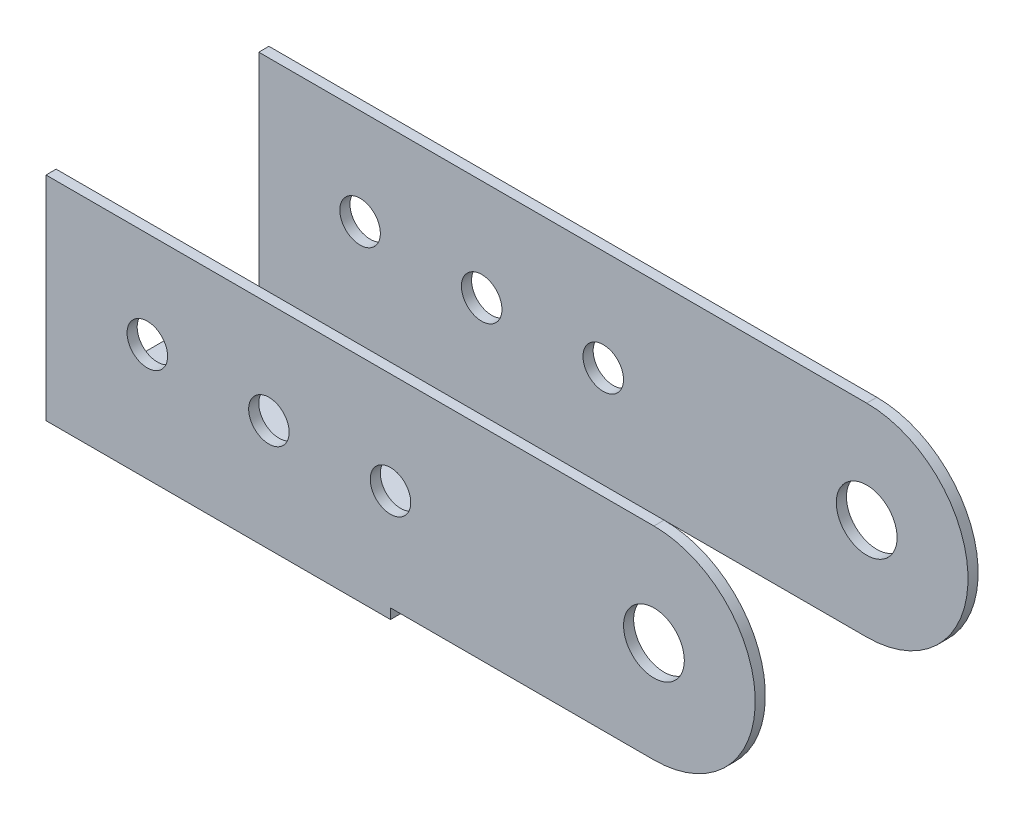
ISO-10303-21;
HEADER;
FILE_DESCRIPTION(('STEP AP214'),'2;1');
FILE_NAME('part.step','',(''),(''),'','','');
FILE_SCHEMA(('AUTOMOTIVE_DESIGN { 1 0 10303 214 1 1 1 1 }'));
ENDSEC;
DATA;
#1=APPLICATION_CONTEXT('core data for automotive mechanical design processes');
#2=APPLICATION_PROTOCOL_DEFINITION('international standard','automotive_design',2000,#1);
#3=PRODUCT_CONTEXT('',#1,'mechanical');
#4=PRODUCT('Part','Part','',(#3));
#5=PRODUCT_RELATED_PRODUCT_CATEGORY('part','',(#4));
#6=PRODUCT_DEFINITION_FORMATION('','',#4);
#7=PRODUCT_DEFINITION_CONTEXT('part definition',#1,'design');
#8=PRODUCT_DEFINITION('design','',#6,#7);
#9=PRODUCT_DEFINITION_SHAPE('','',#8);
#10=(LENGTH_UNIT() NAMED_UNIT(*) SI_UNIT(.MILLI.,.METRE.));
#11=(NAMED_UNIT(*) PLANE_ANGLE_UNIT() SI_UNIT($,.RADIAN.));
#12=(NAMED_UNIT(*) SI_UNIT($,.STERADIAN.) SOLID_ANGLE_UNIT());
#13=UNCERTAINTY_MEASURE_WITH_UNIT(LENGTH_MEASURE(1.E-05),#10,'distance_accuracy_value','');
#14=(GEOMETRIC_REPRESENTATION_CONTEXT(3) GLOBAL_UNCERTAINTY_ASSIGNED_CONTEXT((#13)) GLOBAL_UNIT_ASSIGNED_CONTEXT((#10,
#11,#12)) REPRESENTATION_CONTEXT('',''));
#15=CARTESIAN_POINT('',(0.,0.,0.));
#16=DIRECTION('',(0.,0.,1.));
#17=DIRECTION('',(1.,0.,0.));
#18=AXIS2_PLACEMENT_3D('',#15,#16,#17);
#19=CARTESIAN_POINT('',(-15.,-5.,10.5));
#20=DIRECTION('',(0.,1.,0.));
#21=DIRECTION('',(0.,0.,1.));
#22=AXIS2_PLACEMENT_3D('',#19,#20,#21);
#23=PLANE('',#22);
#24=DIRECTION('',(0.,0.,1.));
#25=VECTOR('',#24,1.);
#26=CARTESIAN_POINT('',(2.00000000000001,-5.,10.5));
#27=LINE('',#26,#25);
#28=CARTESIAN_POINT('',(2.00000000000001,-5.,10.));
#29=VERTEX_POINT('',#28);
#30=CARTESIAN_POINT('',(2.00000000000001,-5.,10.5));
#31=VERTEX_POINT('',#30);
#32=EDGE_CURVE('E11',#29,#31,#27,.T.);
#33=ORIENTED_EDGE('',*,*,#32,.F.);
#34=DIRECTION('',(1.,0.,0.));
#35=VECTOR('',#34,1.);
#36=CARTESIAN_POINT('',(-15.,-5.,10.));
#37=LINE('',#36,#35);
#38=CARTESIAN_POINT('',(15.,-5.,10.));
#39=VERTEX_POINT('',#38);
#40=EDGE_CURVE('E221',#29,#39,#37,.T.);
#41=ORIENTED_EDGE('',*,*,#40,.T.);
#42=DIRECTION('',(0.,0.,-1.));
#43=VECTOR('',#42,1.);
#44=CARTESIAN_POINT('',(15.,-5.,10.5));
#45=LINE('',#44,#43);
#46=CARTESIAN_POINT('',(15.,-5.,10.5));
#47=VERTEX_POINT('',#46);
#48=EDGE_CURVE('E44',#47,#39,#45,.T.);
#49=ORIENTED_EDGE('',*,*,#48,.F.);
#50=DIRECTION('',(1.,0.,0.));
#51=VECTOR('',#50,1.);
#52=CARTESIAN_POINT('',(-15.,-5.,10.5));
#53=LINE('',#52,#51);
#54=EDGE_CURVE('E51',#31,#47,#53,.T.);
#55=ORIENTED_EDGE('',*,*,#54,.F.);
#56=EDGE_LOOP('',(#33,#41,#49,#55));
#57=FACE_BOUND('',#56,.T.);
#58=ADVANCED_FACE('F36',(#57),#23,.F.);
#59=CARTESIAN_POINT('',(15.,0.,10.5));
#60=DIRECTION('',(0.,0.,1.));
#61=DIRECTION('',(1.,0.,0.));
#62=AXIS2_PLACEMENT_3D('',#59,#60,#61);
#63=PLANE('',#62);
#64=CARTESIAN_POINT('',(-3.99999999999999,0.,10.5));
#65=DIRECTION('',(0.,0.,1.));
#66=DIRECTION('',(1.,0.,0.));
#67=AXIS2_PLACEMENT_3D('',#64,#65,#66);
#68=CIRCLE('',#67,1.);
#69=CARTESIAN_POINT('',(-2.99999999999999,0.,10.5));
#70=VERTEX_POINT('',#69);
#71=EDGE_CURVE('E193',#70,#70,#68,.T.);
#72=ORIENTED_EDGE('',*,*,#71,.F.);
#73=EDGE_LOOP('',(#72));
#74=FACE_BOUND('',#73,.T.);
#75=CARTESIAN_POINT('',(15.,0.,10.5));
#76=DIRECTION('',(0.,0.,1.));
#77=DIRECTION('',(1.,0.,0.));
#78=AXIS2_PLACEMENT_3D('',#75,#76,#77);
#79=CIRCLE('',#78,1.5);
#80=CARTESIAN_POINT('',(16.5,0.,10.5));
#81=VERTEX_POINT('',#80);
#82=EDGE_CURVE('E205',#81,#81,#79,.T.);
#83=ORIENTED_EDGE('',*,*,#82,.F.);
#84=EDGE_LOOP('',(#83));
#85=FACE_BOUND('',#84,.T.);
#86=DIRECTION('',(0.,-1.,0.));
#87=VECTOR('',#86,1.);
#88=CARTESIAN_POINT('',(-15.,5.,10.5));
#89=LINE('',#88,#87);
#90=CARTESIAN_POINT('',(-15.,5.,10.5));
#91=VERTEX_POINT('',#90);
#92=CARTESIAN_POINT('',(-15.,-5.5,10.5));
#93=VERTEX_POINT('',#92);
#94=EDGE_CURVE('E211',#91,#93,#89,.T.);
#95=ORIENTED_EDGE('',*,*,#94,.T.);
#96=DIRECTION('',(-1.,0.,0.));
#97=VECTOR('',#96,1.);
#98=CARTESIAN_POINT('',(-15.,-5.5,10.5));
#99=LINE('',#98,#97);
#100=CARTESIAN_POINT('',(2.00000000000001,-5.5,10.5));
#101=VERTEX_POINT('',#100);
#102=EDGE_CURVE('E167',#101,#93,#99,.T.);
#103=ORIENTED_EDGE('',*,*,#102,.F.);
#104=DIRECTION('',(0.,1.,0.));
#105=VECTOR('',#104,1.);
#106=CARTESIAN_POINT('',(2.00000000000001,-5.5,10.5));
#107=LINE('',#106,#105);
#108=EDGE_CURVE('E183',#101,#31,#107,.T.);
#109=ORIENTED_EDGE('',*,*,#108,.T.);
#110=ORIENTED_EDGE('',*,*,#54,.T.);
#111=CARTESIAN_POINT('',(15.,0.,10.5));
#112=DIRECTION('',(0.,0.,1.));
#113=DIRECTION('',(1.,0.,0.));
#114=AXIS2_PLACEMENT_3D('',#111,#112,#113);
#115=CIRCLE('',#114,5.);
#116=CARTESIAN_POINT('',(15.,5.,10.5));
#117=VERTEX_POINT('',#116);
#118=EDGE_CURVE('E215',#47,#117,#115,.T.);
#119=ORIENTED_EDGE('',*,*,#118,.T.);
#120=DIRECTION('',(-1.,0.,0.));
#121=VECTOR('',#120,1.);
#122=CARTESIAN_POINT('',(15.,5.,10.5));
#123=LINE('',#122,#121);
#124=EDGE_CURVE('E217',#117,#91,#123,.T.);
#125=ORIENTED_EDGE('',*,*,#124,.T.);
#126=EDGE_LOOP('',(#95,#103,#109,#110,#119,#125));
#127=FACE_BOUND('',#126,.T.);
#128=CARTESIAN_POINT('',(2.00000000000001,0.,10.5));
#129=DIRECTION('',(0.,0.,1.));
#130=DIRECTION('',(1.,0.,0.));
#131=AXIS2_PLACEMENT_3D('',#128,#129,#130);
#132=CIRCLE('',#131,1.);
#133=CARTESIAN_POINT('',(3.00000000000001,0.,10.5));
#134=VERTEX_POINT('',#133);
#135=EDGE_CURVE('E199',#134,#134,#132,.T.);
#136=ORIENTED_EDGE('',*,*,#135,.F.);
#137=EDGE_LOOP('',(#136));
#138=FACE_BOUND('',#137,.T.);
#139=CARTESIAN_POINT('',(-10.,0.253438211378566,10.5));
#140=DIRECTION('',(0.,0.,1.));
#141=DIRECTION('',(1.,0.,0.));
#142=AXIS2_PLACEMENT_3D('',#139,#140,#141);
#143=CIRCLE('',#142,1.);
#144=CARTESIAN_POINT('',(-9.,0.253438211378566,10.5));
#145=VERTEX_POINT('',#144);
#146=EDGE_CURVE('E187',#145,#145,#143,.T.);
#147=ORIENTED_EDGE('',*,*,#146,.F.);
#148=EDGE_LOOP('',(#147));
#149=FACE_BOUND('',#148,.T.);
#150=ADVANCED_FACE('F253',(#74,#85,#127,#138,#149),#63,.T.);
#151=CARTESIAN_POINT('',(15.,0.,10.));
#152=DIRECTION('',(0.,0.,1.));
#153=DIRECTION('',(1.,0.,0.));
#154=AXIS2_PLACEMENT_3D('',#151,#152,#153);
#155=PLANE('',#154);
#156=DIRECTION('',(0.,-1.,0.));
#157=VECTOR('',#156,1.);
#158=CARTESIAN_POINT('',(-15.,5.,10.));
#159=LINE('',#158,#157);
#160=CARTESIAN_POINT('',(-15.,5.,10.));
#161=VERTEX_POINT('',#160);
#162=CARTESIAN_POINT('',(-15.,-5.,10.));
#163=VERTEX_POINT('',#162);
#164=EDGE_CURVE('E208',#161,#163,#159,.T.);
#165=ORIENTED_EDGE('',*,*,#164,.F.);
#166=DIRECTION('',(-1.,0.,0.));
#167=VECTOR('',#166,1.);
#168=CARTESIAN_POINT('',(15.,5.,10.));
#169=LINE('',#168,#167);
#170=CARTESIAN_POINT('',(15.,5.,10.));
#171=VERTEX_POINT('',#170);
#172=EDGE_CURVE('E213',#171,#161,#169,.T.);
#173=ORIENTED_EDGE('',*,*,#172,.F.);
#174=CARTESIAN_POINT('',(15.,0.,10.));
#175=DIRECTION('',(0.,0.,1.));
#176=DIRECTION('',(1.,0.,0.));
#177=AXIS2_PLACEMENT_3D('',#174,#175,#176);
#178=CIRCLE('',#177,5.);
#179=EDGE_CURVE('E225',#39,#171,#178,.T.);
#180=ORIENTED_EDGE('',*,*,#179,.F.);
#181=ORIENTED_EDGE('',*,*,#40,.F.);
#182=EDGE_CURVE('E222',#163,#29,#37,.T.);
#183=ORIENTED_EDGE('',*,*,#182,.F.);
#184=EDGE_LOOP('',(#165,#173,#180,#181,#183));
#185=FACE_BOUND('',#184,.T.);
#186=CARTESIAN_POINT('',(15.,0.,10.));
#187=DIRECTION('',(0.,0.,1.));
#188=DIRECTION('',(1.,0.,0.));
#189=AXIS2_PLACEMENT_3D('',#186,#187,#188);
#190=CIRCLE('',#189,1.5);
#191=CARTESIAN_POINT('',(16.5,0.,10.));
#192=VERTEX_POINT('',#191);
#193=EDGE_CURVE('E202',#192,#192,#190,.T.);
#194=ORIENTED_EDGE('',*,*,#193,.T.);
#195=EDGE_LOOP('',(#194));
#196=FACE_BOUND('',#195,.T.);
#197=CARTESIAN_POINT('',(2.00000000000001,0.,10.));
#198=DIRECTION('',(0.,0.,1.));
#199=DIRECTION('',(1.,0.,0.));
#200=AXIS2_PLACEMENT_3D('',#197,#198,#199);
#201=CIRCLE('',#200,1.);
#202=CARTESIAN_POINT('',(3.00000000000001,0.,10.));
#203=VERTEX_POINT('',#202);
#204=EDGE_CURVE('E196',#203,#203,#201,.T.);
#205=ORIENTED_EDGE('',*,*,#204,.T.);
#206=EDGE_LOOP('',(#205));
#207=FACE_BOUND('',#206,.T.);
#208=CARTESIAN_POINT('',(-3.99999999999999,0.,10.));
#209=DIRECTION('',(0.,0.,1.));
#210=DIRECTION('',(1.,0.,0.));
#211=AXIS2_PLACEMENT_3D('',#208,#209,#210);
#212=CIRCLE('',#211,1.);
#213=CARTESIAN_POINT('',(-2.99999999999999,0.,10.));
#214=VERTEX_POINT('',#213);
#215=EDGE_CURVE('E190',#214,#214,#212,.T.);
#216=ORIENTED_EDGE('',*,*,#215,.T.);
#217=EDGE_LOOP('',(#216));
#218=FACE_BOUND('',#217,.T.);
#219=CARTESIAN_POINT('',(-10.,0.253438211378566,10.));
#220=DIRECTION('',(0.,0.,1.));
#221=DIRECTION('',(1.,0.,0.));
#222=AXIS2_PLACEMENT_3D('',#219,#220,#221);
#223=CIRCLE('',#222,1.);
#224=CARTESIAN_POINT('',(-9.,0.253438211378566,10.));
#225=VERTEX_POINT('',#224);
#226=EDGE_CURVE('E186',#225,#225,#223,.T.);
#227=ORIENTED_EDGE('',*,*,#226,.T.);
#228=EDGE_LOOP('',(#227));
#229=FACE_BOUND('',#228,.T.);
#230=ADVANCED_FACE('F242',(#185,#196,#207,#218,#229),#155,.F.);
#231=CARTESIAN_POINT('',(-15.,5.,10.5));
#232=DIRECTION('',(1.,0.,0.));
#233=DIRECTION('',(0.,0.,-1.));
#234=AXIS2_PLACEMENT_3D('',#231,#232,#233);
#235=PLANE('',#234);
#236=ORIENTED_EDGE('',*,*,#164,.T.);
#237=DIRECTION('',(0.,0.,-1.));
#238=VECTOR('',#237,1.);
#239=CARTESIAN_POINT('',(-15.,-5.,-0.5));
#240=LINE('',#239,#238);
#241=CARTESIAN_POINT('',(-15.,-5.,0.));
#242=VERTEX_POINT('',#241);
#243=EDGE_CURVE('E168',#163,#242,#240,.T.);
#244=ORIENTED_EDGE('',*,*,#243,.T.);
#245=DIRECTION('',(0.,-1.,0.));
#246=VECTOR('',#245,1.);
#247=CARTESIAN_POINT('',(-15.,5.,0.));
#248=LINE('',#247,#246);
#249=CARTESIAN_POINT('',(-15.,5.,0.));
#250=VERTEX_POINT('',#249);
#251=EDGE_CURVE('E160',#250,#242,#248,.T.);
#252=ORIENTED_EDGE('',*,*,#251,.F.);
#253=DIRECTION('',(0.,0.,1.));
#254=VECTOR('',#253,1.);
#255=CARTESIAN_POINT('',(-15.,5.,-0.5));
#256=LINE('',#255,#254);
#257=CARTESIAN_POINT('',(-15.,5.,-0.5));
#258=VERTEX_POINT('',#257);
#259=EDGE_CURVE('E129',#258,#250,#256,.T.);
#260=ORIENTED_EDGE('',*,*,#259,.F.);
#261=DIRECTION('',(0.,1.,0.));
#262=VECTOR('',#261,1.);
#263=CARTESIAN_POINT('',(-15.,-5.5,-0.5));
#264=LINE('',#263,#262);
#265=CARTESIAN_POINT('',(-15.,-5.5,-0.5));
#266=VERTEX_POINT('',#265);
#267=EDGE_CURVE('E139',#266,#258,#264,.T.);
#268=ORIENTED_EDGE('',*,*,#267,.F.);
#269=DIRECTION('',(0.,0.,-1.));
#270=VECTOR('',#269,1.);
#271=CARTESIAN_POINT('',(-15.,-5.5,-0.5));
#272=LINE('',#271,#270);
#273=EDGE_CURVE('E171',#93,#266,#272,.T.);
#274=ORIENTED_EDGE('',*,*,#273,.F.);
#275=ORIENTED_EDGE('',*,*,#94,.F.);
#276=DIRECTION('',(0.,0.,-1.));
#277=VECTOR('',#276,1.);
#278=CARTESIAN_POINT('',(-15.,5.,10.5));
#279=LINE('',#278,#277);
#280=EDGE_CURVE('E219',#91,#161,#279,.T.);
#281=ORIENTED_EDGE('',*,*,#280,.T.);
#282=EDGE_LOOP('',(#236,#244,#252,#260,#268,#274,#275,#281));
#283=FACE_BOUND('',#282,.T.);
#284=ADVANCED_FACE('F38',(#283),#235,.F.);
#285=CARTESIAN_POINT('',(15.,0.,10.5));
#286=DIRECTION('',(0.,0.,-1.));
#287=DIRECTION('',(-1.,0.,0.));
#288=AXIS2_PLACEMENT_3D('',#285,#286,#287);
#289=CYLINDRICAL_SURFACE('',#288,5.);
#290=ORIENTED_EDGE('',*,*,#179,.T.);
#291=DIRECTION('',(0.,0.,-1.));
#292=VECTOR('',#291,1.);
#293=CARTESIAN_POINT('',(15.,5.,10.5));
#294=LINE('',#293,#292);
#295=EDGE_CURVE('E230',#117,#171,#294,.T.);
#296=ORIENTED_EDGE('',*,*,#295,.F.);
#297=ORIENTED_EDGE('',*,*,#118,.F.);
#298=ORIENTED_EDGE('',*,*,#48,.T.);
#299=EDGE_LOOP('',(#290,#296,#297,#298));
#300=FACE_BOUND('',#299,.T.);
#301=ADVANCED_FACE('F236',(#300),#289,.T.);
#302=CARTESIAN_POINT('',(15.,5.,10.5));
#303=DIRECTION('',(0.,-1.,0.));
#304=DIRECTION('',(0.,0.,-1.));
#305=AXIS2_PLACEMENT_3D('',#302,#303,#304);
#306=PLANE('',#305);
#307=ORIENTED_EDGE('',*,*,#172,.T.);
#308=ORIENTED_EDGE('',*,*,#280,.F.);
#309=ORIENTED_EDGE('',*,*,#124,.F.);
#310=ORIENTED_EDGE('',*,*,#295,.T.);
#311=EDGE_LOOP('',(#307,#308,#309,#310));
#312=FACE_BOUND('',#311,.T.);
#313=ADVANCED_FACE('F247',(#312),#306,.F.);
#314=CARTESIAN_POINT('',(15.,0.,10.5));
#315=DIRECTION('',(0.,0.,-1.));
#316=DIRECTION('',(-1.,0.,0.));
#317=AXIS2_PLACEMENT_3D('',#314,#315,#316);
#318=CYLINDRICAL_SURFACE('',#317,1.5);
#319=ORIENTED_EDGE('',*,*,#82,.T.);
#320=EDGE_LOOP('',(#319));
#321=FACE_BOUND('',#320,.T.);
#322=ORIENTED_EDGE('',*,*,#193,.F.);
#323=EDGE_LOOP('',(#322));
#324=FACE_BOUND('',#323,.T.);
#325=ADVANCED_FACE('F272',(#321,#324),#318,.F.);
#326=CARTESIAN_POINT('',(2.00000000000001,0.,10.5));
#327=DIRECTION('',(0.,0.,-1.));
#328=DIRECTION('',(-1.,0.,0.));
#329=AXIS2_PLACEMENT_3D('',#326,#327,#328);
#330=CYLINDRICAL_SURFACE('',#329,1.);
#331=ORIENTED_EDGE('',*,*,#135,.T.);
#332=EDGE_LOOP('',(#331));
#333=FACE_BOUND('',#332,.T.);
#334=ORIENTED_EDGE('',*,*,#204,.F.);
#335=EDGE_LOOP('',(#334));
#336=FACE_BOUND('',#335,.T.);
#337=ADVANCED_FACE('F277',(#333,#336),#330,.F.);
#338=CARTESIAN_POINT('',(-3.99999999999999,0.,10.5));
#339=DIRECTION('',(0.,0.,-1.));
#340=DIRECTION('',(-1.,0.,0.));
#341=AXIS2_PLACEMENT_3D('',#338,#339,#340);
#342=CYLINDRICAL_SURFACE('',#341,1.);
#343=ORIENTED_EDGE('',*,*,#71,.T.);
#344=EDGE_LOOP('',(#343));
#345=FACE_BOUND('',#344,.T.);
#346=ORIENTED_EDGE('',*,*,#215,.F.);
#347=EDGE_LOOP('',(#346));
#348=FACE_BOUND('',#347,.T.);
#349=ADVANCED_FACE('F281',(#345,#348),#342,.F.);
#350=CARTESIAN_POINT('',(-10.,0.253438211378566,10.5));
#351=DIRECTION('',(0.,0.,-1.));
#352=DIRECTION('',(-1.,0.,0.));
#353=AXIS2_PLACEMENT_3D('',#350,#351,#352);
#354=CYLINDRICAL_SURFACE('',#353,1.);
#355=ORIENTED_EDGE('',*,*,#146,.T.);
#356=EDGE_LOOP('',(#355));
#357=FACE_BOUND('',#356,.T.);
#358=ORIENTED_EDGE('',*,*,#226,.F.);
#359=EDGE_LOOP('',(#358));
#360=FACE_BOUND('',#359,.T.);
#361=ADVANCED_FACE('F285',(#357,#360),#354,.F.);
#362=CARTESIAN_POINT('',(0.,-5.,0.));
#363=DIRECTION('',(0.,1.,0.));
#364=DIRECTION('',(0.,0.,1.));
#365=AXIS2_PLACEMENT_3D('',#362,#363,#364);
#366=PLANE('',#365);
#367=DIRECTION('',(1.,0.,0.));
#368=VECTOR('',#367,1.);
#369=CARTESIAN_POINT('',(-15.,-5.,0.));
#370=LINE('',#369,#368);
#371=CARTESIAN_POINT('',(2.00000000000001,-5.,0.));
#372=VERTEX_POINT('',#371);
#373=EDGE_CURVE('E146',#242,#372,#370,.T.);
#374=ORIENTED_EDGE('',*,*,#373,.F.);
#375=ORIENTED_EDGE('',*,*,#243,.F.);
#376=ORIENTED_EDGE('',*,*,#182,.T.);
#377=DIRECTION('',(0.,0.,1.));
#378=VECTOR('',#377,1.);
#379=CARTESIAN_POINT('',(2.00000000000001,-5.,10.5));
#380=LINE('',#379,#378);
#381=EDGE_CURVE('E57',#372,#29,#380,.T.);
#382=ORIENTED_EDGE('',*,*,#381,.F.);
#383=EDGE_LOOP('',(#374,#375,#376,#382));
#384=FACE_BOUND('',#383,.T.);
#385=ADVANCED_FACE('F289',(#384),#366,.T.);
#386=CARTESIAN_POINT('',(2.00000000000001,-5.5,10.5));
#387=DIRECTION('',(-1.,0.,0.));
#388=DIRECTION('',(0.,0.,1.));
#389=AXIS2_PLACEMENT_3D('',#386,#387,#388);
#390=PLANE('',#389);
#391=CARTESIAN_POINT('',(2.00000000000001,-5.,-0.5));
#392=VERTEX_POINT('',#391);
#393=EDGE_CURVE('E176',#392,#372,#380,.T.);
#394=ORIENTED_EDGE('',*,*,#393,.T.);
#395=ORIENTED_EDGE('',*,*,#381,.T.);
#396=ORIENTED_EDGE('',*,*,#32,.T.);
#397=ORIENTED_EDGE('',*,*,#108,.F.);
#398=DIRECTION('',(0.,0.,1.));
#399=VECTOR('',#398,1.);
#400=CARTESIAN_POINT('',(2.00000000000001,-5.5,10.5));
#401=LINE('',#400,#399);
#402=CARTESIAN_POINT('',(2.00000000000001,-5.5,-0.5));
#403=VERTEX_POINT('',#402);
#404=EDGE_CURVE('E164',#403,#101,#401,.T.);
#405=ORIENTED_EDGE('',*,*,#404,.F.);
#406=DIRECTION('',(0.,1.,0.));
#407=VECTOR('',#406,1.);
#408=CARTESIAN_POINT('',(2.00000000000001,-5.5,-0.5));
#409=LINE('',#408,#407);
#410=EDGE_CURVE('E175',#403,#392,#409,.T.);
#411=ORIENTED_EDGE('',*,*,#410,.T.);
#412=EDGE_LOOP('',(#394,#395,#396,#397,#405,#411));
#413=FACE_BOUND('',#412,.T.);
#414=ADVANCED_FACE('F260',(#413),#390,.F.);
#415=CARTESIAN_POINT('',(2.00000000000001,-5.5,-0.5));
#416=DIRECTION('',(0.,0.,1.));
#417=DIRECTION('',(1.,0.,0.));
#418=AXIS2_PLACEMENT_3D('',#415,#416,#417);
#419=PLANE('',#418);
#420=ORIENTED_EDGE('',*,*,#267,.T.);
#421=DIRECTION('',(-1.,0.,0.));
#422=VECTOR('',#421,1.);
#423=CARTESIAN_POINT('',(-15.,5.,-0.5));
#424=LINE('',#423,#422);
#425=CARTESIAN_POINT('',(15.,5.,-0.5));
#426=VERTEX_POINT('',#425);
#427=EDGE_CURVE('E122',#426,#258,#424,.T.);
#428=ORIENTED_EDGE('',*,*,#427,.F.);
#429=CARTESIAN_POINT('',(15.,0.,-0.5));
#430=DIRECTION('',(0.,0.,1.));
#431=DIRECTION('',(1.,0.,0.));
#432=AXIS2_PLACEMENT_3D('',#429,#430,#431);
#433=CIRCLE('',#432,5.);
#434=CARTESIAN_POINT('',(15.,-5.,-0.5));
#435=VERTEX_POINT('',#434);
#436=EDGE_CURVE('E136',#435,#426,#433,.T.);
#437=ORIENTED_EDGE('',*,*,#436,.F.);
#438=DIRECTION('',(1.,0.,0.));
#439=VECTOR('',#438,1.);
#440=CARTESIAN_POINT('',(-15.,-5.,-0.5));
#441=LINE('',#440,#439);
#442=EDGE_CURVE('E130',#392,#435,#441,.T.);
#443=ORIENTED_EDGE('',*,*,#442,.F.);
#444=ORIENTED_EDGE('',*,*,#410,.F.);
#445=DIRECTION('',(1.,0.,0.));
#446=VECTOR('',#445,1.);
#447=CARTESIAN_POINT('',(2.00000000000001,-5.5,-0.5));
#448=LINE('',#447,#446);
#449=EDGE_CURVE('E173',#266,#403,#448,.T.);
#450=ORIENTED_EDGE('',*,*,#449,.F.);
#451=EDGE_LOOP('',(#420,#428,#437,#443,#444,#450));
#452=FACE_BOUND('',#451,.T.);
#453=CARTESIAN_POINT('',(2.00000000000001,0.,-0.5));
#454=DIRECTION('',(0.,0.,1.));
#455=DIRECTION('',(1.,0.,0.));
#456=AXIS2_PLACEMENT_3D('',#453,#454,#455);
#457=CIRCLE('',#456,1.);
#458=CARTESIAN_POINT('',(3.00000000000001,0.,-0.5));
#459=VERTEX_POINT('',#458);
#460=EDGE_CURVE('E332',#459,#459,#457,.T.);
#461=ORIENTED_EDGE('',*,*,#460,.T.);
#462=EDGE_LOOP('',(#461));
#463=FACE_BOUND('',#462,.T.);
#464=CARTESIAN_POINT('',(-3.99999999999999,0.,-0.5));
#465=DIRECTION('',(0.,0.,1.));
#466=DIRECTION('',(1.,0.,0.));
#467=AXIS2_PLACEMENT_3D('',#464,#465,#466);
#468=CIRCLE('',#467,1.);
#469=CARTESIAN_POINT('',(-2.99999999999999,0.,-0.5));
#470=VERTEX_POINT('',#469);
#471=EDGE_CURVE('E340',#470,#470,#468,.T.);
#472=ORIENTED_EDGE('',*,*,#471,.T.);
#473=EDGE_LOOP('',(#472));
#474=FACE_BOUND('',#473,.T.);
#475=CARTESIAN_POINT('',(-10.,0.253438211378566,-0.5));
#476=DIRECTION('',(0.,0.,1.));
#477=DIRECTION('',(1.,0.,0.));
#478=AXIS2_PLACEMENT_3D('',#475,#476,#477);
#479=CIRCLE('',#478,1.);
#480=CARTESIAN_POINT('',(-9.,0.253438211378566,-0.5));
#481=VERTEX_POINT('',#480);
#482=EDGE_CURVE('E346',#481,#481,#479,.T.);
#483=ORIENTED_EDGE('',*,*,#482,.T.);
#484=EDGE_LOOP('',(#483));
#485=FACE_BOUND('',#484,.T.);
#486=CARTESIAN_POINT('',(15.,0.,-0.5));
#487=DIRECTION('',(0.,0.,1.));
#488=DIRECTION('',(1.,0.,0.));
#489=AXIS2_PLACEMENT_3D('',#486,#487,#488);
#490=CIRCLE('',#489,1.5);
#491=CARTESIAN_POINT('',(16.5,0.,-0.5));
#492=VERTEX_POINT('',#491);
#493=EDGE_CURVE('E158',#492,#492,#490,.T.);
#494=ORIENTED_EDGE('',*,*,#493,.T.);
#495=EDGE_LOOP('',(#494));
#496=FACE_BOUND('',#495,.T.);
#497=ADVANCED_FACE('F134',(#452,#463,#474,#485,#496),#419,.F.);
#498=CARTESIAN_POINT('',(0.,-5.5,0.));
#499=DIRECTION('',(0.,1.,0.));
#500=DIRECTION('',(0.,0.,1.));
#501=AXIS2_PLACEMENT_3D('',#498,#499,#500);
#502=PLANE('',#501);
#503=ORIENTED_EDGE('',*,*,#404,.T.);
#504=ORIENTED_EDGE('',*,*,#102,.T.);
#505=ORIENTED_EDGE('',*,*,#273,.T.);
#506=ORIENTED_EDGE('',*,*,#449,.T.);
#507=EDGE_LOOP('',(#503,#504,#505,#506));
#508=FACE_BOUND('',#507,.T.);
#509=ADVANCED_FACE('F256',(#508),#502,.F.);
#510=CARTESIAN_POINT('',(-15.,-5.,-0.5));
#511=DIRECTION('',(0.,-1.,0.));
#512=DIRECTION('',(0.,0.,-1.));
#513=AXIS2_PLACEMENT_3D('',#510,#511,#512);
#514=PLANE('',#513);
#515=ORIENTED_EDGE('',*,*,#393,.F.);
#516=ORIENTED_EDGE('',*,*,#442,.T.);
#517=DIRECTION('',(0.,0.,1.));
#518=VECTOR('',#517,1.);
#519=CARTESIAN_POINT('',(15.,-5.,-0.5));
#520=LINE('',#519,#518);
#521=CARTESIAN_POINT('',(15.,-5.,0.));
#522=VERTEX_POINT('',#521);
#523=EDGE_CURVE('E145',#435,#522,#520,.T.);
#524=ORIENTED_EDGE('',*,*,#523,.T.);
#525=EDGE_CURVE('E149',#372,#522,#370,.T.);
#526=ORIENTED_EDGE('',*,*,#525,.F.);
#527=EDGE_LOOP('',(#515,#516,#524,#526));
#528=FACE_BOUND('',#527,.T.);
#529=ADVANCED_FACE('F300',(#528),#514,.T.);
#530=CARTESIAN_POINT('',(15.,0.,-0.5));
#531=DIRECTION('',(0.,0.,1.));
#532=DIRECTION('',(1.,0.,0.));
#533=AXIS2_PLACEMENT_3D('',#530,#531,#532);
#534=CYLINDRICAL_SURFACE('',#533,5.);
#535=CARTESIAN_POINT('',(15.,0.,0.));
#536=DIRECTION('',(0.,0.,1.));
#537=DIRECTION('',(1.,0.,0.));
#538=AXIS2_PLACEMENT_3D('',#535,#536,#537);
#539=CIRCLE('',#538,5.);
#540=CARTESIAN_POINT('',(15.,5.,0.));
#541=VERTEX_POINT('',#540);
#542=EDGE_CURVE('E156',#522,#541,#539,.T.);
#543=ORIENTED_EDGE('',*,*,#542,.F.);
#544=ORIENTED_EDGE('',*,*,#523,.F.);
#545=ORIENTED_EDGE('',*,*,#436,.T.);
#546=DIRECTION('',(0.,0.,1.));
#547=VECTOR('',#546,1.);
#548=CARTESIAN_POINT('',(15.,5.,-0.5));
#549=LINE('',#548,#547);
#550=EDGE_CURVE('E119',#426,#541,#549,.T.);
#551=ORIENTED_EDGE('',*,*,#550,.T.);
#552=EDGE_LOOP('',(#543,#544,#545,#551));
#553=FACE_BOUND('',#552,.T.);
#554=ADVANCED_FACE('F143',(#553),#534,.T.);
#555=CARTESIAN_POINT('',(-15.,5.,-0.5));
#556=DIRECTION('',(0.,1.,0.));
#557=DIRECTION('',(0.,0.,1.));
#558=AXIS2_PLACEMENT_3D('',#555,#556,#557);
#559=PLANE('',#558);
#560=DIRECTION('',(-1.,0.,0.));
#561=VECTOR('',#560,1.);
#562=CARTESIAN_POINT('',(-15.,5.,0.));
#563=LINE('',#562,#561);
#564=EDGE_CURVE('E124',#541,#250,#563,.T.);
#565=ORIENTED_EDGE('',*,*,#564,.F.);
#566=ORIENTED_EDGE('',*,*,#550,.F.);
#567=ORIENTED_EDGE('',*,*,#427,.T.);
#568=ORIENTED_EDGE('',*,*,#259,.T.);
#569=EDGE_LOOP('',(#565,#566,#567,#568));
#570=FACE_BOUND('',#569,.T.);
#571=ADVANCED_FACE('F121',(#570),#559,.T.);
#572=CARTESIAN_POINT('',(15.,0.,0.));
#573=DIRECTION('',(0.,0.,1.));
#574=DIRECTION('',(1.,0.,0.));
#575=AXIS2_PLACEMENT_3D('',#572,#573,#574);
#576=PLANE('',#575);
#577=CARTESIAN_POINT('',(2.00000000000001,0.,0.));
#578=DIRECTION('',(0.,0.,1.));
#579=DIRECTION('',(1.,0.,0.));
#580=AXIS2_PLACEMENT_3D('',#577,#578,#579);
#581=CIRCLE('',#580,1.);
#582=CARTESIAN_POINT('',(3.00000000000001,0.,0.));
#583=VERTEX_POINT('',#582);
#584=EDGE_CURVE('E335',#583,#583,#581,.T.);
#585=ORIENTED_EDGE('',*,*,#584,.F.);
#586=EDGE_LOOP('',(#585));
#587=FACE_BOUND('',#586,.T.);
#588=CARTESIAN_POINT('',(-3.99999999999999,0.,0.));
#589=DIRECTION('',(0.,0.,1.));
#590=DIRECTION('',(1.,0.,0.));
#591=AXIS2_PLACEMENT_3D('',#588,#589,#590);
#592=CIRCLE('',#591,1.);
#593=CARTESIAN_POINT('',(-2.99999999999999,0.,0.));
#594=VERTEX_POINT('',#593);
#595=EDGE_CURVE('E337',#594,#594,#592,.T.);
#596=ORIENTED_EDGE('',*,*,#595,.F.);
#597=EDGE_LOOP('',(#596));
#598=FACE_BOUND('',#597,.T.);
#599=CARTESIAN_POINT('',(-10.,0.253438211378566,0.));
#600=DIRECTION('',(0.,0.,1.));
#601=DIRECTION('',(1.,0.,0.));
#602=AXIS2_PLACEMENT_3D('',#599,#600,#601);
#603=CIRCLE('',#602,1.);
#604=CARTESIAN_POINT('',(-9.,0.253438211378566,0.));
#605=VERTEX_POINT('',#604);
#606=EDGE_CURVE('E343',#605,#605,#603,.T.);
#607=ORIENTED_EDGE('',*,*,#606,.F.);
#608=EDGE_LOOP('',(#607));
#609=FACE_BOUND('',#608,.T.);
#610=CARTESIAN_POINT('',(15.,0.,0.));
#611=DIRECTION('',(0.,0.,1.));
#612=DIRECTION('',(1.,0.,0.));
#613=AXIS2_PLACEMENT_3D('',#610,#611,#612);
#614=CIRCLE('',#613,1.5);
#615=CARTESIAN_POINT('',(16.5,0.,0.));
#616=VERTEX_POINT('',#615);
#617=EDGE_CURVE('E152',#616,#616,#614,.T.);
#618=ORIENTED_EDGE('',*,*,#617,.F.);
#619=EDGE_LOOP('',(#618));
#620=FACE_BOUND('',#619,.T.);
#621=ORIENTED_EDGE('',*,*,#542,.T.);
#622=ORIENTED_EDGE('',*,*,#564,.T.);
#623=ORIENTED_EDGE('',*,*,#251,.T.);
#624=ORIENTED_EDGE('',*,*,#373,.T.);
#625=ORIENTED_EDGE('',*,*,#525,.T.);
#626=EDGE_LOOP('',(#621,#622,#623,#624,#625));
#627=FACE_BOUND('',#626,.T.);
#628=ADVANCED_FACE('F305',(#587,#598,#609,#620,#627),#576,.T.);
#629=CARTESIAN_POINT('',(15.,0.,-0.5));
#630=DIRECTION('',(0.,0.,1.));
#631=DIRECTION('',(1.,0.,0.));
#632=AXIS2_PLACEMENT_3D('',#629,#630,#631);
#633=CYLINDRICAL_SURFACE('',#632,1.5);
#634=ORIENTED_EDGE('',*,*,#493,.F.);
#635=EDGE_LOOP('',(#634));
#636=FACE_BOUND('',#635,.T.);
#637=ORIENTED_EDGE('',*,*,#617,.T.);
#638=EDGE_LOOP('',(#637));
#639=FACE_BOUND('',#638,.T.);
#640=ADVANCED_FACE('F311',(#636,#639),#633,.F.);
#641=CARTESIAN_POINT('',(-10.,0.253438211378566,-0.5));
#642=DIRECTION('',(0.,0.,1.));
#643=DIRECTION('',(1.,0.,0.));
#644=AXIS2_PLACEMENT_3D('',#641,#642,#643);
#645=CYLINDRICAL_SURFACE('',#644,1.);
#646=ORIENTED_EDGE('',*,*,#482,.F.);
#647=EDGE_LOOP('',(#646));
#648=FACE_BOUND('',#647,.T.);
#649=ORIENTED_EDGE('',*,*,#606,.T.);
#650=EDGE_LOOP('',(#649));
#651=FACE_BOUND('',#650,.T.);
#652=ADVANCED_FACE('F315',(#648,#651),#645,.F.);
#653=CARTESIAN_POINT('',(-3.99999999999999,0.,-0.5));
#654=DIRECTION('',(0.,0.,1.));
#655=DIRECTION('',(1.,0.,0.));
#656=AXIS2_PLACEMENT_3D('',#653,#654,#655);
#657=CYLINDRICAL_SURFACE('',#656,1.);
#658=ORIENTED_EDGE('',*,*,#471,.F.);
#659=EDGE_LOOP('',(#658));
#660=FACE_BOUND('',#659,.T.);
#661=ORIENTED_EDGE('',*,*,#595,.T.);
#662=EDGE_LOOP('',(#661));
#663=FACE_BOUND('',#662,.T.);
#664=ADVANCED_FACE('F319',(#660,#663),#657,.F.);
#665=CARTESIAN_POINT('',(2.00000000000001,0.,-0.5));
#666=DIRECTION('',(0.,0.,1.));
#667=DIRECTION('',(1.,0.,0.));
#668=AXIS2_PLACEMENT_3D('',#665,#666,#667);
#669=CYLINDRICAL_SURFACE('',#668,1.);
#670=ORIENTED_EDGE('',*,*,#460,.F.);
#671=EDGE_LOOP('',(#670));
#672=FACE_BOUND('',#671,.T.);
#673=ORIENTED_EDGE('',*,*,#584,.T.);
#674=EDGE_LOOP('',(#673));
#675=FACE_BOUND('',#674,.T.);
#676=ADVANCED_FACE('F323',(#672,#675),#669,.F.);
#677=CLOSED_SHELL('',(#58,#150,#230,#284,#301,#313,#325,#337,#349,#361,#385,#414,#497,#509,#529,
#554,#571,#628,#640,#652,#664,#676));
#678=MANIFOLD_SOLID_BREP('B2',#677);
#679=ADVANCED_BREP_SHAPE_REPRESENTATION('',(#18,#678),#14);
#680=SHAPE_DEFINITION_REPRESENTATION(#9,#679);
ENDSEC;
END-ISO-10303-21;
